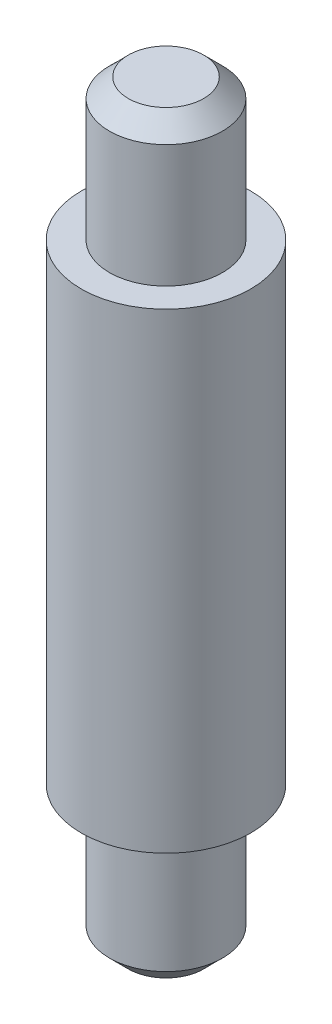
ISO-10303-21;
HEADER;
FILE_DESCRIPTION(('STEP AP214'),'2;1');
FILE_NAME('part.step','',(''),(''),'','','');
FILE_SCHEMA(('AUTOMOTIVE_DESIGN { 1 0 10303 214 1 1 1 1 }'));
ENDSEC;
DATA;
#1=APPLICATION_CONTEXT('core data for automotive mechanical design processes');
#2=APPLICATION_PROTOCOL_DEFINITION('international standard','automotive_design',2000,#1);
#3=PRODUCT_CONTEXT('',#1,'mechanical');
#4=PRODUCT('Part','Part','',(#3));
#5=PRODUCT_RELATED_PRODUCT_CATEGORY('part','',(#4));
#6=PRODUCT_DEFINITION_FORMATION('','',#4);
#7=PRODUCT_DEFINITION_CONTEXT('part definition',#1,'design');
#8=PRODUCT_DEFINITION('design','',#6,#7);
#9=PRODUCT_DEFINITION_SHAPE('','',#8);
#10=(LENGTH_UNIT() NAMED_UNIT(*) SI_UNIT(.MILLI.,.METRE.));
#11=(NAMED_UNIT(*) PLANE_ANGLE_UNIT() SI_UNIT($,.RADIAN.));
#12=(NAMED_UNIT(*) SI_UNIT($,.STERADIAN.) SOLID_ANGLE_UNIT());
#13=UNCERTAINTY_MEASURE_WITH_UNIT(LENGTH_MEASURE(1.E-05),#10,'distance_accuracy_value','');
#14=(GEOMETRIC_REPRESENTATION_CONTEXT(3) GLOBAL_UNCERTAINTY_ASSIGNED_CONTEXT((#13)) GLOBAL_UNIT_ASSIGNED_CONTEXT((#10,
#11,#12)) REPRESENTATION_CONTEXT('',''));
#15=CARTESIAN_POINT('',(0.,0.,0.));
#16=DIRECTION('',(0.,0.,1.));
#17=DIRECTION('',(1.,0.,0.));
#18=AXIS2_PLACEMENT_3D('',#15,#16,#17);
#19=CARTESIAN_POINT('',(0.,25.,0.));
#20=DIRECTION('',(0.,-1.,0.));
#21=DIRECTION('',(0.,0.,-1.));
#22=AXIS2_PLACEMENT_3D('',#19,#20,#21);
#23=CYLINDRICAL_SURFACE('',#22,9.);
#24=CARTESIAN_POINT('',(0.,25.,0.));
#25=DIRECTION('',(0.,1.,0.));
#26=DIRECTION('',(0.,0.,1.));
#27=AXIS2_PLACEMENT_3D('',#24,#25,#26);
#28=CIRCLE('',#27,9.);
#29=CARTESIAN_POINT('',(0.,25.,9.));
#30=VERTEX_POINT('',#29);
#31=EDGE_CURVE('E54',#30,#30,#28,.T.);
#32=ORIENTED_EDGE('',*,*,#31,.F.);
#33=EDGE_LOOP('',(#32));
#34=FACE_BOUND('',#33,.T.);
#35=CARTESIAN_POINT('',(0.,-25.,0.));
#36=DIRECTION('',(0.,1.,0.));
#37=DIRECTION('',(0.,0.,1.));
#38=AXIS2_PLACEMENT_3D('',#35,#36,#37);
#39=CIRCLE('',#38,9.);
#40=CARTESIAN_POINT('',(0.,-25.,9.));
#41=VERTEX_POINT('',#40);
#42=EDGE_CURVE('E55',#41,#41,#39,.T.);
#43=ORIENTED_EDGE('',*,*,#42,.T.);
#44=EDGE_LOOP('',(#43));
#45=FACE_BOUND('',#44,.T.);
#46=ADVANCED_FACE('F31',(#34,#45),#23,.T.);
#47=CARTESIAN_POINT('',(0.,25.,0.));
#48=DIRECTION('',(0.,1.,0.));
#49=DIRECTION('',(0.,0.,1.));
#50=AXIS2_PLACEMENT_3D('',#47,#48,#49);
#51=PLANE('',#50);
#52=CARTESIAN_POINT('',(0.,25.,0.));
#53=DIRECTION('',(0.,1.,0.));
#54=DIRECTION('',(0.,0.,1.));
#55=AXIS2_PLACEMENT_3D('',#52,#53,#54);
#56=CIRCLE('',#55,6.);
#57=CARTESIAN_POINT('',(0.,25.,6.));
#58=VERTEX_POINT('',#57);
#59=EDGE_CURVE('E58',#58,#58,#56,.F.);
#60=ORIENTED_EDGE('',*,*,#59,.T.);
#61=EDGE_LOOP('',(#60));
#62=FACE_BOUND('',#61,.T.);
#63=ORIENTED_EDGE('',*,*,#31,.T.);
#64=EDGE_LOOP('',(#63));
#65=FACE_BOUND('',#64,.T.);
#66=ADVANCED_FACE('F64',(#62,#65),#51,.T.);
#67=CARTESIAN_POINT('',(0.,-25.,0.));
#68=DIRECTION('',(0.,1.,0.));
#69=DIRECTION('',(0.,0.,1.));
#70=AXIS2_PLACEMENT_3D('',#67,#68,#69);
#71=PLANE('',#70);
#72=CARTESIAN_POINT('',(0.,-25.,0.));
#73=DIRECTION('',(0.,1.,0.));
#74=DIRECTION('',(0.,0.,1.));
#75=AXIS2_PLACEMENT_3D('',#72,#73,#74);
#76=CIRCLE('',#75,6.);
#77=CARTESIAN_POINT('',(0.,-25.,6.));
#78=VERTEX_POINT('',#77);
#79=EDGE_CURVE('E51',#78,#78,#76,.F.);
#80=ORIENTED_EDGE('',*,*,#79,.F.);
#81=EDGE_LOOP('',(#80));
#82=FACE_BOUND('',#81,.T.);
#83=ORIENTED_EDGE('',*,*,#42,.F.);
#84=EDGE_LOOP('',(#83));
#85=FACE_BOUND('',#84,.T.);
#86=ADVANCED_FACE('F88',(#82,#85),#71,.F.);
#87=CARTESIAN_POINT('',(0.,-40.,0.));
#88=DIRECTION('',(0.,1.,0.));
#89=DIRECTION('',(0.,0.,1.));
#90=AXIS2_PLACEMENT_3D('',#87,#88,#89);
#91=PLANE('',#90);
#92=CARTESIAN_POINT('',(0.,-40.,0.));
#93=DIRECTION('',(0.,1.,0.));
#94=DIRECTION('',(0.,0.,1.));
#95=AXIS2_PLACEMENT_3D('',#92,#93,#94);
#96=CIRCLE('',#95,3.99999999999998);
#97=CARTESIAN_POINT('',(0.,-40.,3.99999999999998));
#98=VERTEX_POINT('',#97);
#99=EDGE_CURVE('E42',#98,#98,#96,.F.);
#100=ORIENTED_EDGE('',*,*,#99,.T.);
#101=EDGE_LOOP('',(#100));
#102=FACE_BOUND('',#101,.T.);
#103=ADVANCED_FACE('F78',(#102),#91,.F.);
#104=CARTESIAN_POINT('',(0.,40.,0.));
#105=DIRECTION('',(0.,-1.,0.));
#106=DIRECTION('',(0.,0.,-1.));
#107=AXIS2_PLACEMENT_3D('',#104,#105,#106);
#108=CYLINDRICAL_SURFACE('',#107,6.);
#109=CARTESIAN_POINT('',(0.,-38.,0.));
#110=DIRECTION('',(0.,1.,0.));
#111=DIRECTION('',(0.,0.,1.));
#112=AXIS2_PLACEMENT_3D('',#109,#110,#111);
#113=CIRCLE('',#112,6.);
#114=CARTESIAN_POINT('',(0.,-38.,6.));
#115=VERTEX_POINT('',#114);
#116=EDGE_CURVE('E46',#115,#115,#113,.T.);
#117=ORIENTED_EDGE('',*,*,#116,.T.);
#118=EDGE_LOOP('',(#117));
#119=FACE_BOUND('',#118,.T.);
#120=ORIENTED_EDGE('',*,*,#79,.T.);
#121=EDGE_LOOP('',(#120));
#122=FACE_BOUND('',#121,.T.);
#123=ADVANCED_FACE('F70',(#119,#122),#108,.T.);
#124=CARTESIAN_POINT('',(0.,38.,0.));
#125=DIRECTION('',(0.,1.,0.));
#126=DIRECTION('',(0.,0.,1.));
#127=AXIS2_PLACEMENT_3D('',#124,#125,#126);
#128=CIRCLE('',#127,6.);
#129=CARTESIAN_POINT('',(0.,38.,6.));
#130=VERTEX_POINT('',#129);
#131=EDGE_CURVE('E10',#130,#130,#128,.F.);
#132=ORIENTED_EDGE('',*,*,#131,.T.);
#133=EDGE_LOOP('',(#132));
#134=FACE_BOUND('',#133,.T.);
#135=ORIENTED_EDGE('',*,*,#59,.F.);
#136=EDGE_LOOP('',(#135));
#137=FACE_BOUND('',#136,.T.);
#138=ADVANCED_FACE('F67',(#134,#137),#108,.T.);
#139=CARTESIAN_POINT('',(0.,40.,0.));
#140=DIRECTION('',(0.,1.,0.));
#141=DIRECTION('',(0.,0.,1.));
#142=AXIS2_PLACEMENT_3D('',#139,#140,#141);
#143=PLANE('',#142);
#144=CARTESIAN_POINT('',(0.,40.,0.));
#145=DIRECTION('',(0.,1.,0.));
#146=DIRECTION('',(0.,0.,1.));
#147=AXIS2_PLACEMENT_3D('',#144,#145,#146);
#148=CIRCLE('',#147,3.99999999999998);
#149=CARTESIAN_POINT('',(0.,40.,3.99999999999998));
#150=VERTEX_POINT('',#149);
#151=EDGE_CURVE('E38',#150,#150,#148,.T.);
#152=ORIENTED_EDGE('',*,*,#151,.T.);
#153=EDGE_LOOP('',(#152));
#154=FACE_BOUND('',#153,.T.);
#155=ADVANCED_FACE('F69',(#154),#143,.T.);
#156=CARTESIAN_POINT('',(0.,-38.,0.));
#157=DIRECTION('',(0.,1.,0.));
#158=DIRECTION('',(0.,0.,1.));
#159=AXIS2_PLACEMENT_3D('',#156,#157,#158);
#160=CONICAL_SURFACE('',#159,6.,0.785398163397449);
#161=ORIENTED_EDGE('',*,*,#99,.F.);
#162=EDGE_LOOP('',(#161));
#163=FACE_BOUND('',#162,.T.);
#164=ORIENTED_EDGE('',*,*,#116,.F.);
#165=EDGE_LOOP('',(#164));
#166=FACE_BOUND('',#165,.T.);
#167=ADVANCED_FACE('F76',(#163,#166),#160,.T.);
#168=CARTESIAN_POINT('',(0.,40.,0.));
#169=DIRECTION('',(0.,-1.,0.));
#170=DIRECTION('',(0.,0.,-1.));
#171=AXIS2_PLACEMENT_3D('',#168,#169,#170);
#172=CONICAL_SURFACE('',#171,3.99999999999998,0.785398163397447);
#173=ORIENTED_EDGE('',*,*,#131,.F.);
#174=EDGE_LOOP('',(#173));
#175=FACE_BOUND('',#174,.T.);
#176=ORIENTED_EDGE('',*,*,#151,.F.);
#177=EDGE_LOOP('',(#176));
#178=FACE_BOUND('',#177,.T.);
#179=ADVANCED_FACE('F33',(#175,#178),#172,.T.);
#180=CLOSED_SHELL('',(#46,#66,#86,#103,#123,#138,#155,#167,#179));
#181=MANIFOLD_SOLID_BREP('B2',#180);
#182=ADVANCED_BREP_SHAPE_REPRESENTATION('',(#18,#181),#14);
#183=SHAPE_DEFINITION_REPRESENTATION(#9,#182);
ENDSEC;
END-ISO-10303-21;
